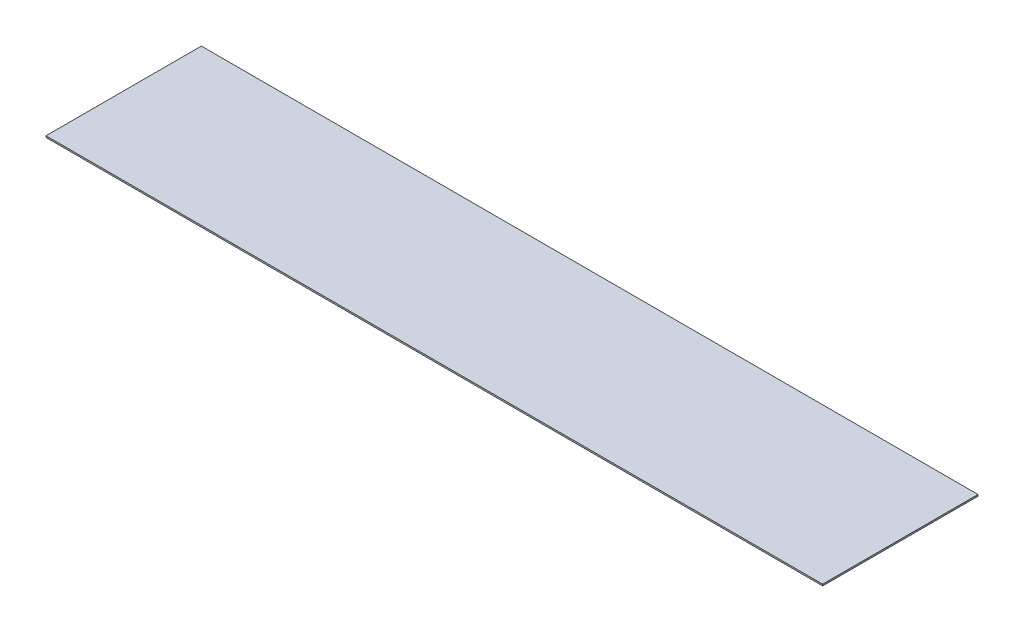
ISO-10303-21;
HEADER;
FILE_DESCRIPTION(('STEP AP214'),'2;1');
FILE_NAME('part.step','',(''),(''),'','','');
FILE_SCHEMA(('AUTOMOTIVE_DESIGN { 1 0 10303 214 1 1 1 1 }'));
ENDSEC;
DATA;
#1=APPLICATION_CONTEXT('core data for automotive mechanical design processes');
#2=APPLICATION_PROTOCOL_DEFINITION('international standard','automotive_design',2000,#1);
#3=PRODUCT_CONTEXT('',#1,'mechanical');
#4=PRODUCT('Part','Part','',(#3));
#5=PRODUCT_RELATED_PRODUCT_CATEGORY('part','',(#4));
#6=PRODUCT_DEFINITION_FORMATION('','',#4);
#7=PRODUCT_DEFINITION_CONTEXT('part definition',#1,'design');
#8=PRODUCT_DEFINITION('design','',#6,#7);
#9=PRODUCT_DEFINITION_SHAPE('','',#8);
#10=(LENGTH_UNIT() NAMED_UNIT(*) SI_UNIT(.MILLI.,.METRE.));
#11=(NAMED_UNIT(*) PLANE_ANGLE_UNIT() SI_UNIT($,.RADIAN.));
#12=(NAMED_UNIT(*) SI_UNIT($,.STERADIAN.) SOLID_ANGLE_UNIT());
#13=UNCERTAINTY_MEASURE_WITH_UNIT(LENGTH_MEASURE(1.E-05),#10,'distance_accuracy_value','');
#14=(GEOMETRIC_REPRESENTATION_CONTEXT(3) GLOBAL_UNCERTAINTY_ASSIGNED_CONTEXT((#13)) GLOBAL_UNIT_ASSIGNED_CONTEXT((#10,
#11,#12)) REPRESENTATION_CONTEXT('',''));
#15=CARTESIAN_POINT('',(0.,0.,0.));
#16=DIRECTION('',(0.,0.,1.));
#17=DIRECTION('',(1.,0.,0.));
#18=AXIS2_PLACEMENT_3D('',#15,#16,#17);
#19=CARTESIAN_POINT('',(635.,2.54,127.));
#20=DIRECTION('',(-1.,0.,0.));
#21=DIRECTION('',(0.,0.,1.));
#22=AXIS2_PLACEMENT_3D('',#19,#20,#21);
#23=PLANE('',#22);
#24=DIRECTION('',(0.,0.,-1.));
#25=VECTOR('',#24,1.);
#26=CARTESIAN_POINT('',(635.,0.,127.));
#27=LINE('',#26,#25);
#28=CARTESIAN_POINT('',(635.,0.,127.));
#29=VERTEX_POINT('',#28);
#30=CARTESIAN_POINT('',(635.,0.,-127.));
#31=VERTEX_POINT('',#30);
#32=EDGE_CURVE('E96',#29,#31,#27,.T.);
#33=ORIENTED_EDGE('',*,*,#32,.T.);
#34=DIRECTION('',(0.,-1.,0.));
#35=VECTOR('',#34,1.);
#36=CARTESIAN_POINT('',(635.,2.54,-127.));
#37=LINE('',#36,#35);
#38=CARTESIAN_POINT('',(635.,2.54,-127.));
#39=VERTEX_POINT('',#38);
#40=EDGE_CURVE('E11',#39,#31,#37,.T.);
#41=ORIENTED_EDGE('',*,*,#40,.F.);
#42=DIRECTION('',(0.,0.,-1.));
#43=VECTOR('',#42,1.);
#44=CARTESIAN_POINT('',(635.,2.54,127.));
#45=LINE('',#44,#43);
#46=CARTESIAN_POINT('',(635.,2.54,127.));
#47=VERTEX_POINT('',#46);
#48=EDGE_CURVE('E84',#47,#39,#45,.T.);
#49=ORIENTED_EDGE('',*,*,#48,.F.);
#50=DIRECTION('',(0.,-1.,0.));
#51=VECTOR('',#50,1.);
#52=CARTESIAN_POINT('',(635.,2.54,127.));
#53=LINE('',#52,#51);
#54=EDGE_CURVE('E92',#47,#29,#53,.T.);
#55=ORIENTED_EDGE('',*,*,#54,.T.);
#56=EDGE_LOOP('',(#33,#41,#49,#55));
#57=FACE_BOUND('',#56,.T.);
#58=ADVANCED_FACE('F33',(#57),#23,.F.);
#59=CARTESIAN_POINT('',(-635.,2.54,-127.));
#60=DIRECTION('',(0.,0.,1.));
#61=DIRECTION('',(1.,0.,0.));
#62=AXIS2_PLACEMENT_3D('',#59,#60,#61);
#63=PLANE('',#62);
#64=DIRECTION('',(-1.,0.,0.));
#65=VECTOR('',#64,1.);
#66=CARTESIAN_POINT('',(-635.,0.,-127.));
#67=LINE('',#66,#65);
#68=CARTESIAN_POINT('',(-635.,0.,-127.));
#69=VERTEX_POINT('',#68);
#70=EDGE_CURVE('E88',#31,#69,#67,.T.);
#71=ORIENTED_EDGE('',*,*,#70,.T.);
#72=DIRECTION('',(0.,-1.,0.));
#73=VECTOR('',#72,1.);
#74=CARTESIAN_POINT('',(-635.,2.54,-127.));
#75=LINE('',#74,#73);
#76=CARTESIAN_POINT('',(-635.,2.54,-127.));
#77=VERTEX_POINT('',#76);
#78=EDGE_CURVE('E41',#77,#69,#75,.T.);
#79=ORIENTED_EDGE('',*,*,#78,.F.);
#80=DIRECTION('',(-1.,0.,0.));
#81=VECTOR('',#80,1.);
#82=CARTESIAN_POINT('',(-635.,2.54,-127.));
#83=LINE('',#82,#81);
#84=EDGE_CURVE('E79',#39,#77,#83,.T.);
#85=ORIENTED_EDGE('',*,*,#84,.F.);
#86=ORIENTED_EDGE('',*,*,#40,.T.);
#87=EDGE_LOOP('',(#71,#79,#85,#86));
#88=FACE_BOUND('',#87,.T.);
#89=ADVANCED_FACE('F87',(#88),#63,.F.);
#90=CARTESIAN_POINT('',(-635.,2.54,127.));
#91=DIRECTION('',(1.,0.,0.));
#92=DIRECTION('',(0.,0.,-1.));
#93=AXIS2_PLACEMENT_3D('',#90,#91,#92);
#94=PLANE('',#93);
#95=DIRECTION('',(0.,0.,1.));
#96=VECTOR('',#95,1.);
#97=CARTESIAN_POINT('',(-635.,0.,127.));
#98=LINE('',#97,#96);
#99=CARTESIAN_POINT('',(-635.,0.,127.));
#100=VERTEX_POINT('',#99);
#101=EDGE_CURVE('E66',#69,#100,#98,.T.);
#102=ORIENTED_EDGE('',*,*,#101,.T.);
#103=DIRECTION('',(0.,-1.,0.));
#104=VECTOR('',#103,1.);
#105=CARTESIAN_POINT('',(-635.,2.54,127.));
#106=LINE('',#105,#104);
#107=CARTESIAN_POINT('',(-635.,2.54,127.));
#108=VERTEX_POINT('',#107);
#109=EDGE_CURVE('E89',#108,#100,#106,.T.);
#110=ORIENTED_EDGE('',*,*,#109,.F.);
#111=DIRECTION('',(0.,0.,1.));
#112=VECTOR('',#111,1.);
#113=CARTESIAN_POINT('',(-635.,2.54,127.));
#114=LINE('',#113,#112);
#115=EDGE_CURVE('E82',#77,#108,#114,.T.);
#116=ORIENTED_EDGE('',*,*,#115,.F.);
#117=ORIENTED_EDGE('',*,*,#78,.T.);
#118=EDGE_LOOP('',(#102,#110,#116,#117));
#119=FACE_BOUND('',#118,.T.);
#120=ADVANCED_FACE('F90',(#119),#94,.F.);
#121=CARTESIAN_POINT('',(-635.,2.54,127.));
#122=DIRECTION('',(0.,0.,-1.));
#123=DIRECTION('',(-1.,0.,0.));
#124=AXIS2_PLACEMENT_3D('',#121,#122,#123);
#125=PLANE('',#124);
#126=DIRECTION('',(1.,0.,0.));
#127=VECTOR('',#126,1.);
#128=CARTESIAN_POINT('',(-635.,0.,127.));
#129=LINE('',#128,#127);
#130=EDGE_CURVE('E72',#100,#29,#129,.T.);
#131=ORIENTED_EDGE('',*,*,#130,.T.);
#132=ORIENTED_EDGE('',*,*,#54,.F.);
#133=DIRECTION('',(1.,0.,0.));
#134=VECTOR('',#133,1.);
#135=CARTESIAN_POINT('',(-635.,2.54,127.));
#136=LINE('',#135,#134);
#137=EDGE_CURVE('E49',#108,#47,#136,.T.);
#138=ORIENTED_EDGE('',*,*,#137,.F.);
#139=ORIENTED_EDGE('',*,*,#109,.T.);
#140=EDGE_LOOP('',(#131,#132,#138,#139));
#141=FACE_BOUND('',#140,.T.);
#142=ADVANCED_FACE('F103',(#141),#125,.F.);
#143=CARTESIAN_POINT('',(0.,2.54,0.));
#144=DIRECTION('',(0.,-1.,0.));
#145=DIRECTION('',(0.,0.,-1.));
#146=AXIS2_PLACEMENT_3D('',#143,#144,#145);
#147=PLANE('',#146);
#148=ORIENTED_EDGE('',*,*,#48,.T.);
#149=ORIENTED_EDGE('',*,*,#84,.T.);
#150=ORIENTED_EDGE('',*,*,#115,.T.);
#151=ORIENTED_EDGE('',*,*,#137,.T.);
#152=EDGE_LOOP('',(#148,#149,#150,#151));
#153=FACE_BOUND('',#152,.T.);
#154=ADVANCED_FACE('F80',(#153),#147,.F.);
#155=CARTESIAN_POINT('',(0.,0.,0.));
#156=DIRECTION('',(0.,-1.,0.));
#157=DIRECTION('',(0.,0.,-1.));
#158=AXIS2_PLACEMENT_3D('',#155,#156,#157);
#159=PLANE('',#158);
#160=ORIENTED_EDGE('',*,*,#32,.F.);
#161=ORIENTED_EDGE('',*,*,#130,.F.);
#162=ORIENTED_EDGE('',*,*,#101,.F.);
#163=ORIENTED_EDGE('',*,*,#70,.F.);
#164=EDGE_LOOP('',(#160,#161,#162,#163));
#165=FACE_BOUND('',#164,.T.);
#166=ADVANCED_FACE('F106',(#165),#159,.T.);
#167=CLOSED_SHELL('',(#58,#89,#120,#142,#154,#166));
#168=MANIFOLD_SOLID_BREP('B2',#167);
#169=ADVANCED_BREP_SHAPE_REPRESENTATION('',(#18,#168),#14);
#170=SHAPE_DEFINITION_REPRESENTATION(#9,#169);
ENDSEC;
END-ISO-10303-21;
